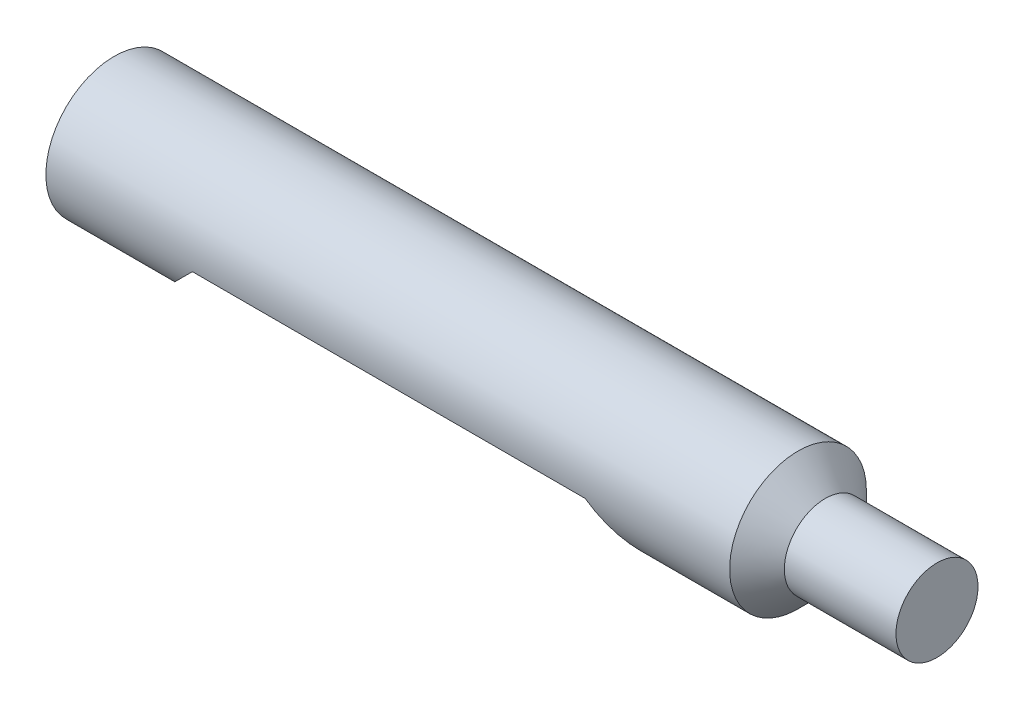
ISO-10303-21;
HEADER;
FILE_DESCRIPTION(('STEP AP214'),'2;1');
FILE_NAME('part.step','',(''),(''),'','','');
FILE_SCHEMA(('AUTOMOTIVE_DESIGN { 1 0 10303 214 1 1 1 1 }'));
ENDSEC;
DATA;
#1=APPLICATION_CONTEXT('core data for automotive mechanical design processes');
#2=APPLICATION_PROTOCOL_DEFINITION('international standard','automotive_design',2000,#1);
#3=PRODUCT_CONTEXT('',#1,'mechanical');
#4=PRODUCT('Part','Part','',(#3));
#5=PRODUCT_RELATED_PRODUCT_CATEGORY('part','',(#4));
#6=PRODUCT_DEFINITION_FORMATION('','',#4);
#7=PRODUCT_DEFINITION_CONTEXT('part definition',#1,'design');
#8=PRODUCT_DEFINITION('design','',#6,#7);
#9=PRODUCT_DEFINITION_SHAPE('','',#8);
#10=(LENGTH_UNIT() NAMED_UNIT(*) SI_UNIT(.MILLI.,.METRE.));
#11=(NAMED_UNIT(*) PLANE_ANGLE_UNIT() SI_UNIT($,.RADIAN.));
#12=(NAMED_UNIT(*) SI_UNIT($,.STERADIAN.) SOLID_ANGLE_UNIT());
#13=UNCERTAINTY_MEASURE_WITH_UNIT(LENGTH_MEASURE(1.E-05),#10,'distance_accuracy_value','');
#14=(GEOMETRIC_REPRESENTATION_CONTEXT(3) GLOBAL_UNCERTAINTY_ASSIGNED_CONTEXT((#13)) GLOBAL_UNIT_ASSIGNED_CONTEXT((#10,
#11,#12)) REPRESENTATION_CONTEXT('',''));
#15=CARTESIAN_POINT('',(0.,0.,0.));
#16=DIRECTION('',(0.,0.,1.));
#17=DIRECTION('',(1.,0.,0.));
#18=AXIS2_PLACEMENT_3D('',#15,#16,#17);
#19=CARTESIAN_POINT('',(0.,0.,0.));
#20=DIRECTION('',(-1.,0.,0.));
#21=DIRECTION('',(0.,0.,1.));
#22=AXIS2_PLACEMENT_3D('',#19,#20,#21);
#23=PLANE('',#22);
#24=CARTESIAN_POINT('',(0.,0.,0.));
#25=DIRECTION('',(1.,0.,0.));
#26=DIRECTION('',(0.,0.,-1.));
#27=AXIS2_PLACEMENT_3D('',#24,#25,#26);
#28=CIRCLE('',#27,5.);
#29=CARTESIAN_POINT('',(0.,0.,-5.));
#30=VERTEX_POINT('',#29);
#31=EDGE_CURVE('E68',#30,#30,#28,.T.);
#32=ORIENTED_EDGE('',*,*,#31,.F.);
#33=EDGE_LOOP('',(#32));
#34=FACE_BOUND('',#33,.T.);
#35=ADVANCED_FACE('F38',(#34),#23,.T.);
#36=CARTESIAN_POINT('',(60.1621621621622,0.,0.));
#37=DIRECTION('',(1.,0.,0.));
#38=DIRECTION('',(0.,0.,-1.));
#39=AXIS2_PLACEMENT_3D('',#36,#37,#38);
#40=CYLINDRICAL_SURFACE('',#39,5.);
#41=CARTESIAN_POINT('',(11.5000000000001,0.,0.));
#42=DIRECTION('',(-0.707106781186544,0.707106781186551,0.));
#43=DIRECTION('',(0.707106781186551,0.707106781186544,0.));
#44=AXIS2_PLACEMENT_3D('',#41,#42,#43);
#45=ELLIPSE('',#44,7.07106781186551,5.);
#46=CARTESIAN_POINT('',(10.64,-0.86,4.92548474771773));
#47=VERTEX_POINT('',#46);
#48=CARTESIAN_POINT('',(10.64,-0.86,-4.92548474771773));
#49=VERTEX_POINT('',#48);
#50=EDGE_CURVE('E11',#47,#49,#45,.F.);
#51=ORIENTED_EDGE('',*,*,#50,.F.);
#52=DIRECTION('',(1.,0.,0.));
#53=VECTOR('',#52,1.);
#54=CARTESIAN_POINT('',(60.1621621621622,-0.86,4.92548474771773));
#55=LINE('',#54,#53);
#56=CARTESIAN_POINT('',(39.3599999999999,-0.86,4.92548474771773));
#57=VERTEX_POINT('',#56);
#58=EDGE_CURVE('E46',#57,#47,#55,.F.);
#59=ORIENTED_EDGE('',*,*,#58,.F.);
#60=CARTESIAN_POINT('',(38.4999999999999,0.,0.));
#61=DIRECTION('',(0.707106781186544,0.707106781186551,0.));
#62=DIRECTION('',(0.707106781186551,-0.707106781186544,0.));
#63=AXIS2_PLACEMENT_3D('',#60,#61,#62);
#64=ELLIPSE('',#63,7.07106781186551,5.);
#65=CARTESIAN_POINT('',(39.3599999999999,-0.86,-4.92548474771773));
#66=VERTEX_POINT('',#65);
#67=EDGE_CURVE('E64',#66,#57,#64,.F.);
#68=ORIENTED_EDGE('',*,*,#67,.F.);
#69=DIRECTION('',(1.,0.,0.));
#70=VECTOR('',#69,1.);
#71=CARTESIAN_POINT('',(60.1621621621622,-0.86,-4.92548474771773));
#72=LINE('',#71,#70);
#73=EDGE_CURVE('E67',#49,#66,#72,.T.);
#74=ORIENTED_EDGE('',*,*,#73,.F.);
#75=EDGE_LOOP('',(#51,#59,#68,#74));
#76=FACE_BOUND('',#75,.T.);
#77=ORIENTED_EDGE('',*,*,#31,.T.);
#78=EDGE_LOOP('',(#77));
#79=FACE_BOUND('',#78,.T.);
#80=CARTESIAN_POINT('',(50.,0.,0.));
#81=DIRECTION('',(1.,0.,0.));
#82=DIRECTION('',(0.,0.,-1.));
#83=AXIS2_PLACEMENT_3D('',#80,#81,#82);
#84=CIRCLE('',#83,5.);
#85=CARTESIAN_POINT('',(50.,0.,-5.));
#86=VERTEX_POINT('',#85);
#87=EDGE_CURVE('E86',#86,#86,#84,.T.);
#88=ORIENTED_EDGE('',*,*,#87,.F.);
#89=EDGE_LOOP('',(#88));
#90=FACE_BOUND('',#89,.T.);
#91=ADVANCED_FACE('F77',(#76,#79,#90),#40,.T.);
#92=CARTESIAN_POINT('',(52.,0.,0.));
#93=DIRECTION('',(-1.,0.,0.));
#94=DIRECTION('',(0.,0.,1.));
#95=AXIS2_PLACEMENT_3D('',#92,#93,#94);
#96=CONICAL_SURFACE('',#95,3.,0.78539816339745);
#97=ORIENTED_EDGE('',*,*,#87,.T.);
#98=EDGE_LOOP('',(#97));
#99=FACE_BOUND('',#98,.T.);
#100=CARTESIAN_POINT('',(52.,0.,0.));
#101=DIRECTION('',(1.,0.,0.));
#102=DIRECTION('',(0.,0.,-1.));
#103=AXIS2_PLACEMENT_3D('',#100,#101,#102);
#104=CIRCLE('',#103,3.);
#105=CARTESIAN_POINT('',(52.,0.,-3.));
#106=VERTEX_POINT('',#105);
#107=EDGE_CURVE('E90',#106,#106,#104,.T.);
#108=ORIENTED_EDGE('',*,*,#107,.F.);
#109=EDGE_LOOP('',(#108));
#110=FACE_BOUND('',#109,.T.);
#111=ADVANCED_FACE('F118',(#99,#110),#96,.T.);
#112=CARTESIAN_POINT('',(60.1621621621622,0.,0.));
#113=DIRECTION('',(1.,0.,0.));
#114=DIRECTION('',(0.,0.,-1.));
#115=AXIS2_PLACEMENT_3D('',#112,#113,#114);
#116=CYLINDRICAL_SURFACE('',#115,3.);
#117=ORIENTED_EDGE('',*,*,#107,.T.);
#118=EDGE_LOOP('',(#117));
#119=FACE_BOUND('',#118,.T.);
#120=CARTESIAN_POINT('',(60.1621621621622,0.,0.));
#121=DIRECTION('',(1.,0.,0.));
#122=DIRECTION('',(0.,0.,-1.));
#123=AXIS2_PLACEMENT_3D('',#120,#121,#122);
#124=CIRCLE('',#123,3.);
#125=CARTESIAN_POINT('',(60.1621621621622,0.,-3.));
#126=VERTEX_POINT('',#125);
#127=EDGE_CURVE('E94',#126,#126,#124,.T.);
#128=ORIENTED_EDGE('',*,*,#127,.F.);
#129=EDGE_LOOP('',(#128));
#130=FACE_BOUND('',#129,.T.);
#131=ADVANCED_FACE('F109',(#119,#130),#116,.T.);
#132=CARTESIAN_POINT('',(60.1621621621622,3.,0.));
#133=DIRECTION('',(1.,0.,0.));
#134=DIRECTION('',(0.,0.,-1.));
#135=AXIS2_PLACEMENT_3D('',#132,#133,#134);
#136=PLANE('',#135);
#137=ORIENTED_EDGE('',*,*,#127,.T.);
#138=EDGE_LOOP('',(#137));
#139=FACE_BOUND('',#138,.T.);
#140=ADVANCED_FACE('F102',(#139),#136,.T.);
#141=CARTESIAN_POINT('',(6.5,-5.,-17.5));
#142=DIRECTION('',(-0.707106781186544,0.707106781186551,0.));
#143=DIRECTION('',(-0.707106781186551,-0.707106781186544,0.));
#144=AXIS2_PLACEMENT_3D('',#141,#142,#143);
#145=PLANE('',#144);
#146=DIRECTION('',(0.,0.,1.));
#147=VECTOR('',#146,1.);
#148=CARTESIAN_POINT('',(10.64,-0.86,-17.5));
#149=LINE('',#148,#147);
#150=EDGE_CURVE('E75',#49,#47,#149,.T.);
#151=ORIENTED_EDGE('',*,*,#150,.T.);
#152=ORIENTED_EDGE('',*,*,#50,.T.);
#153=EDGE_LOOP('',(#151,#152));
#154=FACE_BOUND('',#153,.T.);
#155=ADVANCED_FACE('F100',(#154),#145,.F.);
#156=CARTESIAN_POINT('',(10.64,-0.86,-17.5));
#157=DIRECTION('',(0.,1.,0.));
#158=DIRECTION('',(-1.,0.,0.));
#159=AXIS2_PLACEMENT_3D('',#156,#157,#158);
#160=PLANE('',#159);
#161=ORIENTED_EDGE('',*,*,#58,.T.);
#162=ORIENTED_EDGE('',*,*,#150,.F.);
#163=ORIENTED_EDGE('',*,*,#73,.T.);
#164=DIRECTION('',(0.,0.,1.));
#165=VECTOR('',#164,1.);
#166=CARTESIAN_POINT('',(39.3599999999999,-0.86,-17.5));
#167=LINE('',#166,#165);
#168=EDGE_CURVE('E52',#66,#57,#167,.T.);
#169=ORIENTED_EDGE('',*,*,#168,.T.);
#170=EDGE_LOOP('',(#161,#162,#163,#169));
#171=FACE_BOUND('',#170,.T.);
#172=ADVANCED_FACE('F71',(#171),#160,.F.);
#173=CARTESIAN_POINT('',(39.3599999999999,-0.86,-17.5));
#174=DIRECTION('',(0.707106781186544,0.707106781186551,0.));
#175=DIRECTION('',(-0.707106781186551,0.707106781186544,0.));
#176=AXIS2_PLACEMENT_3D('',#173,#174,#175);
#177=PLANE('',#176);
#178=ORIENTED_EDGE('',*,*,#67,.T.);
#179=ORIENTED_EDGE('',*,*,#168,.F.);
#180=EDGE_LOOP('',(#178,#179));
#181=FACE_BOUND('',#180,.T.);
#182=ADVANCED_FACE('F65',(#181),#177,.F.);
#183=CLOSED_SHELL('',(#35,#91,#111,#131,#140,#155,#172,#182));
#184=MANIFOLD_SOLID_BREP('B2',#183);
#185=ADVANCED_BREP_SHAPE_REPRESENTATION('',(#18,#184),#14);
#186=SHAPE_DEFINITION_REPRESENTATION(#9,#185);
ENDSEC;
END-ISO-10303-21;
